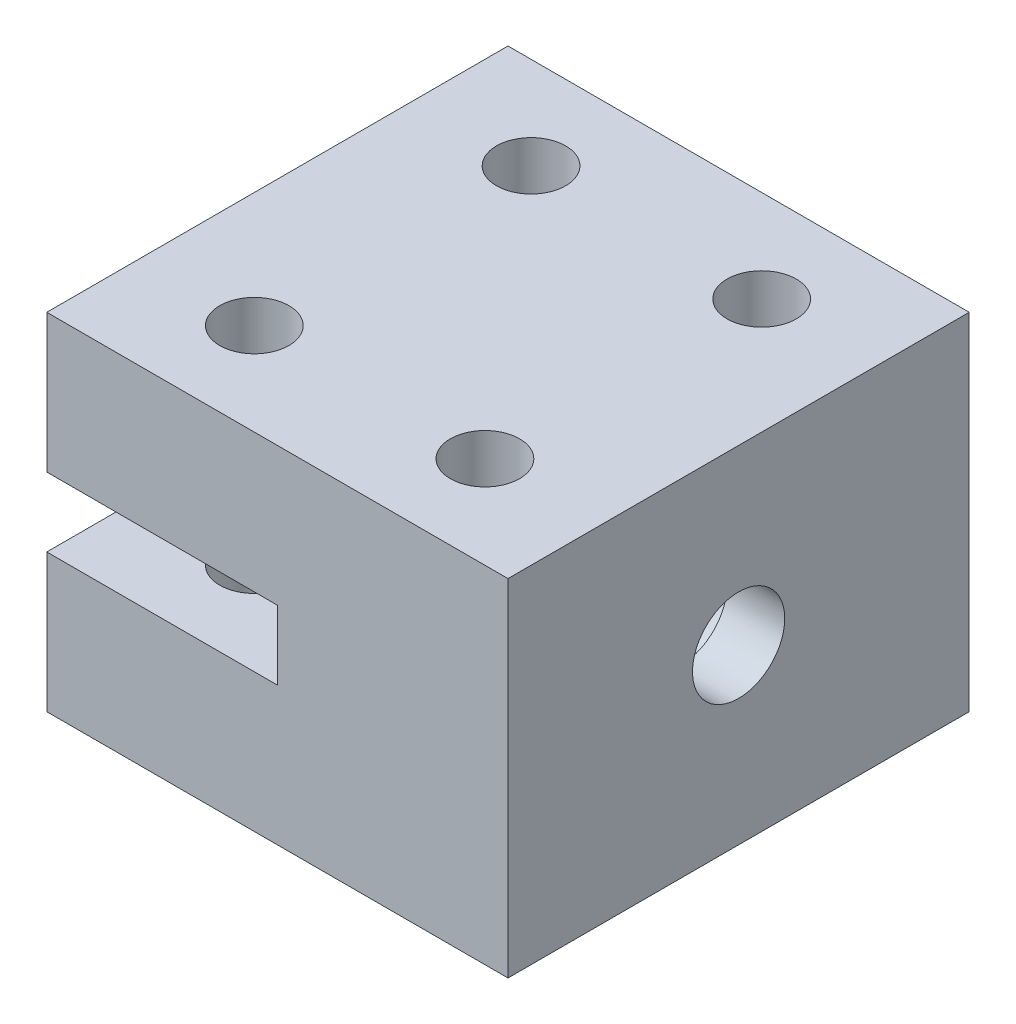
ISO-10303-21;
HEADER;
FILE_DESCRIPTION(('STEP AP214'),'2;1');
FILE_NAME('part.step','',(''),(''),'','','');
FILE_SCHEMA(('AUTOMOTIVE_DESIGN { 1 0 10303 214 1 1 1 1 }'));
ENDSEC;
DATA;
#1=APPLICATION_CONTEXT('core data for automotive mechanical design processes');
#2=APPLICATION_PROTOCOL_DEFINITION('international standard','automotive_design',2000,#1);
#3=PRODUCT_CONTEXT('',#1,'mechanical');
#4=PRODUCT('Part','Part','',(#3));
#5=PRODUCT_RELATED_PRODUCT_CATEGORY('part','',(#4));
#6=PRODUCT_DEFINITION_FORMATION('','',#4);
#7=PRODUCT_DEFINITION_CONTEXT('part definition',#1,'design');
#8=PRODUCT_DEFINITION('design','',#6,#7);
#9=PRODUCT_DEFINITION_SHAPE('','',#8);
#10=(LENGTH_UNIT() NAMED_UNIT(*) SI_UNIT(.MILLI.,.METRE.));
#11=(NAMED_UNIT(*) PLANE_ANGLE_UNIT() SI_UNIT($,.RADIAN.));
#12=(NAMED_UNIT(*) SI_UNIT($,.STERADIAN.) SOLID_ANGLE_UNIT());
#13=UNCERTAINTY_MEASURE_WITH_UNIT(LENGTH_MEASURE(1.E-05),#10,'distance_accuracy_value','');
#14=(GEOMETRIC_REPRESENTATION_CONTEXT(3) GLOBAL_UNCERTAINTY_ASSIGNED_CONTEXT((#13)) GLOBAL_UNIT_ASSIGNED_CONTEXT((#10,
#11,#12)) REPRESENTATION_CONTEXT('',''));
#15=CARTESIAN_POINT('',(0.,0.,0.));
#16=DIRECTION('',(0.,0.,1.));
#17=DIRECTION('',(1.,0.,0.));
#18=AXIS2_PLACEMENT_3D('',#15,#16,#17);
#19=CARTESIAN_POINT('',(9.99999999999999,7.5,-10.));
#20=DIRECTION('',(-1.,0.,0.));
#21=DIRECTION('',(0.,0.,1.));
#22=AXIS2_PLACEMENT_3D('',#19,#20,#21);
#23=PLANE('',#22);
#24=CARTESIAN_POINT('',(9.99999999999999,0.,0.));
#25=DIRECTION('',(1.,0.,0.));
#26=DIRECTION('',(0.,0.,-1.));
#27=AXIS2_PLACEMENT_3D('',#24,#25,#26);
#28=CIRCLE('',#27,2.);
#29=CARTESIAN_POINT('',(9.99999999999999,0.,-2.));
#30=VERTEX_POINT('',#29);
#31=EDGE_CURVE('E149',#30,#30,#28,.T.);
#32=ORIENTED_EDGE('',*,*,#31,.F.);
#33=EDGE_LOOP('',(#32));
#34=FACE_BOUND('',#33,.T.);
#35=DIRECTION('',(0.,-1.,0.));
#36=VECTOR('',#35,1.);
#37=CARTESIAN_POINT('',(9.99999999999999,7.5,-10.));
#38=LINE('',#37,#36);
#39=CARTESIAN_POINT('',(9.99999999999999,7.5,-10.));
#40=VERTEX_POINT('',#39);
#41=CARTESIAN_POINT('',(9.99999999999999,-7.5,-10.));
#42=VERTEX_POINT('',#41);
#43=EDGE_CURVE('E74',#40,#42,#38,.T.);
#44=ORIENTED_EDGE('',*,*,#43,.F.);
#45=DIRECTION('',(0.,0.,-1.));
#46=VECTOR('',#45,1.);
#47=CARTESIAN_POINT('',(9.99999999999999,7.5,-10.));
#48=LINE('',#47,#46);
#49=CARTESIAN_POINT('',(9.99999999999999,7.5,10.));
#50=VERTEX_POINT('',#49);
#51=EDGE_CURVE('E138',#50,#40,#48,.T.);
#52=ORIENTED_EDGE('',*,*,#51,.F.);
#53=DIRECTION('',(0.,-1.,0.));
#54=VECTOR('',#53,1.);
#55=CARTESIAN_POINT('',(9.99999999999999,7.5,10.));
#56=LINE('',#55,#54);
#57=CARTESIAN_POINT('',(9.99999999999999,-7.5,10.));
#58=VERTEX_POINT('',#57);
#59=EDGE_CURVE('E99',#50,#58,#56,.T.);
#60=ORIENTED_EDGE('',*,*,#59,.T.);
#61=DIRECTION('',(0.,0.,-1.));
#62=VECTOR('',#61,1.);
#63=CARTESIAN_POINT('',(9.99999999999999,-7.5,-10.));
#64=LINE('',#63,#62);
#65=EDGE_CURVE('E88',#58,#42,#64,.T.);
#66=ORIENTED_EDGE('',*,*,#65,.T.);
#67=EDGE_LOOP('',(#44,#52,#60,#66));
#68=FACE_BOUND('',#67,.T.);
#69=ADVANCED_FACE('F32',(#34,#68),#23,.F.);
#70=CARTESIAN_POINT('',(-10.,7.5,-10.));
#71=DIRECTION('',(0.,0.,1.));
#72=DIRECTION('',(1.,0.,0.));
#73=AXIS2_PLACEMENT_3D('',#70,#71,#72);
#74=PLANE('',#73);
#75=DIRECTION('',(-1.,0.,0.));
#76=VECTOR('',#75,1.);
#77=CARTESIAN_POINT('',(-10.,-1.5,-10.));
#78=LINE('',#77,#76);
#79=CARTESIAN_POINT('',(0.,-1.5,-10.));
#80=VERTEX_POINT('',#79);
#81=CARTESIAN_POINT('',(-10.,-1.5,-10.));
#82=VERTEX_POINT('',#81);
#83=EDGE_CURVE('E106',#80,#82,#78,.T.);
#84=ORIENTED_EDGE('',*,*,#83,.F.);
#85=DIRECTION('',(0.,-1.,0.));
#86=VECTOR('',#85,1.);
#87=CARTESIAN_POINT('',(0.,1.5,-10.));
#88=LINE('',#87,#86);
#89=CARTESIAN_POINT('',(0.,1.5,-10.));
#90=VERTEX_POINT('',#89);
#91=EDGE_CURVE('E118',#90,#80,#88,.T.);
#92=ORIENTED_EDGE('',*,*,#91,.F.);
#93=DIRECTION('',(-1.,0.,0.));
#94=VECTOR('',#93,1.);
#95=CARTESIAN_POINT('',(-10.,1.5,-10.));
#96=LINE('',#95,#94);
#97=CARTESIAN_POINT('',(-10.,1.5,-10.));
#98=VERTEX_POINT('',#97);
#99=EDGE_CURVE('E146',#90,#98,#96,.T.);
#100=ORIENTED_EDGE('',*,*,#99,.T.);
#101=DIRECTION('',(0.,-1.,0.));
#102=VECTOR('',#101,1.);
#103=CARTESIAN_POINT('',(-10.,7.5,-10.));
#104=LINE('',#103,#102);
#105=CARTESIAN_POINT('',(-10.,7.5,-10.));
#106=VERTEX_POINT('',#105);
#107=EDGE_CURVE('E123',#106,#98,#104,.T.);
#108=ORIENTED_EDGE('',*,*,#107,.F.);
#109=DIRECTION('',(-1.,0.,0.));
#110=VECTOR('',#109,1.);
#111=CARTESIAN_POINT('',(-10.,7.5,-10.));
#112=LINE('',#111,#110);
#113=EDGE_CURVE('E83',#40,#106,#112,.T.);
#114=ORIENTED_EDGE('',*,*,#113,.F.);
#115=ORIENTED_EDGE('',*,*,#43,.T.);
#116=DIRECTION('',(-1.,0.,0.));
#117=VECTOR('',#116,1.);
#118=CARTESIAN_POINT('',(-10.,-7.5,-10.));
#119=LINE('',#118,#117);
#120=CARTESIAN_POINT('',(-10.,-7.5,-10.));
#121=VERTEX_POINT('',#120);
#122=EDGE_CURVE('E78',#42,#121,#119,.T.);
#123=ORIENTED_EDGE('',*,*,#122,.T.);
#124=DIRECTION('',(0.,-1.,0.));
#125=VECTOR('',#124,1.);
#126=CARTESIAN_POINT('',(-10.,7.5,-10.));
#127=LINE('',#126,#125);
#128=EDGE_CURVE('E96',#82,#121,#127,.T.);
#129=ORIENTED_EDGE('',*,*,#128,.F.);
#130=EDGE_LOOP('',(#84,#92,#100,#108,#114,#115,#123,#129));
#131=FACE_BOUND('',#130,.T.);
#132=ADVANCED_FACE('F76',(#131),#74,.F.);
#133=CARTESIAN_POINT('',(-10.,7.5,-10.));
#134=DIRECTION('',(1.,0.,0.));
#135=DIRECTION('',(0.,0.,-1.));
#136=AXIS2_PLACEMENT_3D('',#133,#134,#135);
#137=PLANE('',#136);
#138=DIRECTION('',(0.,0.,1.));
#139=VECTOR('',#138,1.);
#140=CARTESIAN_POINT('',(-10.,-1.5,-10.));
#141=LINE('',#140,#139);
#142=CARTESIAN_POINT('',(-10.,-1.5,10.));
#143=VERTEX_POINT('',#142);
#144=EDGE_CURVE('E40',#82,#143,#141,.T.);
#145=ORIENTED_EDGE('',*,*,#144,.F.);
#146=ORIENTED_EDGE('',*,*,#128,.T.);
#147=DIRECTION('',(0.,0.,1.));
#148=VECTOR('',#147,1.);
#149=CARTESIAN_POINT('',(-10.,-7.5,-10.));
#150=LINE('',#149,#148);
#151=CARTESIAN_POINT('',(-10.,-7.5,10.));
#152=VERTEX_POINT('',#151);
#153=EDGE_CURVE('E95',#121,#152,#150,.T.);
#154=ORIENTED_EDGE('',*,*,#153,.T.);
#155=DIRECTION('',(0.,-1.,0.));
#156=VECTOR('',#155,1.);
#157=CARTESIAN_POINT('',(-10.,7.5,10.));
#158=LINE('',#157,#156);
#159=EDGE_CURVE('E110',#143,#152,#158,.T.);
#160=ORIENTED_EDGE('',*,*,#159,.F.);
#161=EDGE_LOOP('',(#145,#146,#154,#160));
#162=FACE_BOUND('',#161,.T.);
#163=ADVANCED_FACE('F224',(#162),#137,.F.);
#164=CARTESIAN_POINT('',(-10.,7.5,10.));
#165=DIRECTION('',(0.,0.,-1.));
#166=DIRECTION('',(-1.,0.,0.));
#167=AXIS2_PLACEMENT_3D('',#164,#165,#166);
#168=PLANE('',#167);
#169=DIRECTION('',(1.,0.,0.));
#170=VECTOR('',#169,1.);
#171=CARTESIAN_POINT('',(-10.,-1.5,10.));
#172=LINE('',#171,#170);
#173=CARTESIAN_POINT('',(0.,-1.5,10.));
#174=VERTEX_POINT('',#173);
#175=EDGE_CURVE('E11',#143,#174,#172,.T.);
#176=ORIENTED_EDGE('',*,*,#175,.F.);
#177=ORIENTED_EDGE('',*,*,#159,.T.);
#178=DIRECTION('',(1.,0.,0.));
#179=VECTOR('',#178,1.);
#180=CARTESIAN_POINT('',(-10.,-7.5,10.));
#181=LINE('',#180,#179);
#182=EDGE_CURVE('E107',#152,#58,#181,.T.);
#183=ORIENTED_EDGE('',*,*,#182,.T.);
#184=ORIENTED_EDGE('',*,*,#59,.F.);
#185=DIRECTION('',(1.,0.,0.));
#186=VECTOR('',#185,1.);
#187=CARTESIAN_POINT('',(-10.,7.5,10.));
#188=LINE('',#187,#186);
#189=CARTESIAN_POINT('',(-10.,7.5,10.));
#190=VERTEX_POINT('',#189);
#191=EDGE_CURVE('E131',#190,#50,#188,.T.);
#192=ORIENTED_EDGE('',*,*,#191,.F.);
#193=DIRECTION('',(0.,-1.,0.));
#194=VECTOR('',#193,1.);
#195=CARTESIAN_POINT('',(-10.,7.5,10.));
#196=LINE('',#195,#194);
#197=CARTESIAN_POINT('',(-10.,1.5,10.));
#198=VERTEX_POINT('',#197);
#199=EDGE_CURVE('E128',#190,#198,#196,.T.);
#200=ORIENTED_EDGE('',*,*,#199,.T.);
#201=DIRECTION('',(1.,0.,0.));
#202=VECTOR('',#201,1.);
#203=CARTESIAN_POINT('',(-10.,1.5,10.));
#204=LINE('',#203,#202);
#205=CARTESIAN_POINT('',(0.,1.5,10.));
#206=VERTEX_POINT('',#205);
#207=EDGE_CURVE('E140',#198,#206,#204,.T.);
#208=ORIENTED_EDGE('',*,*,#207,.T.);
#209=DIRECTION('',(0.,-1.,0.));
#210=VECTOR('',#209,1.);
#211=CARTESIAN_POINT('',(0.,1.5,10.));
#212=LINE('',#211,#210);
#213=EDGE_CURVE('E102',#206,#174,#212,.T.);
#214=ORIENTED_EDGE('',*,*,#213,.T.);
#215=EDGE_LOOP('',(#176,#177,#183,#184,#192,#200,#208,#214));
#216=FACE_BOUND('',#215,.T.);
#217=ADVANCED_FACE('F254',(#216),#168,.F.);
#218=CARTESIAN_POINT('',(0.,-7.5,0.));
#219=DIRECTION('',(0.,1.,0.));
#220=DIRECTION('',(0.,0.,1.));
#221=AXIS2_PLACEMENT_3D('',#218,#219,#220);
#222=PLANE('',#221);
#223=CARTESIAN_POINT('',(-5.,-7.5,6.));
#224=DIRECTION('',(0.,1.,0.));
#225=DIRECTION('',(0.,0.,1.));
#226=AXIS2_PLACEMENT_3D('',#223,#224,#225);
#227=CIRCLE('',#226,1.5);
#228=CARTESIAN_POINT('',(-5.,-7.5,7.5));
#229=VERTEX_POINT('',#228);
#230=EDGE_CURVE('E171',#229,#229,#227,.T.);
#231=ORIENTED_EDGE('',*,*,#230,.T.);
#232=EDGE_LOOP('',(#231));
#233=FACE_BOUND('',#232,.T.);
#234=CARTESIAN_POINT('',(5.,-7.5,6.));
#235=DIRECTION('',(0.,1.,0.));
#236=DIRECTION('',(0.,0.,1.));
#237=AXIS2_PLACEMENT_3D('',#234,#235,#236);
#238=CIRCLE('',#237,1.5);
#239=CARTESIAN_POINT('',(5.,-7.5,7.5));
#240=VERTEX_POINT('',#239);
#241=EDGE_CURVE('E178',#240,#240,#238,.T.);
#242=ORIENTED_EDGE('',*,*,#241,.T.);
#243=EDGE_LOOP('',(#242));
#244=FACE_BOUND('',#243,.T.);
#245=CARTESIAN_POINT('',(5.,-7.5,-6.));
#246=DIRECTION('',(0.,1.,0.));
#247=DIRECTION('',(0.,0.,1.));
#248=AXIS2_PLACEMENT_3D('',#245,#246,#247);
#249=CIRCLE('',#248,1.5);
#250=CARTESIAN_POINT('',(5.,-7.5,-4.5));
#251=VERTEX_POINT('',#250);
#252=EDGE_CURVE('E170',#251,#251,#249,.T.);
#253=ORIENTED_EDGE('',*,*,#252,.T.);
#254=EDGE_LOOP('',(#253));
#255=FACE_BOUND('',#254,.T.);
#256=CARTESIAN_POINT('',(-5.,-7.5,-6.));
#257=DIRECTION('',(0.,1.,0.));
#258=DIRECTION('',(0.,0.,1.));
#259=AXIS2_PLACEMENT_3D('',#256,#257,#258);
#260=CIRCLE('',#259,1.5);
#261=CARTESIAN_POINT('',(-5.,-7.5,-4.5));
#262=VERTEX_POINT('',#261);
#263=EDGE_CURVE('E164',#262,#262,#260,.T.);
#264=ORIENTED_EDGE('',*,*,#263,.T.);
#265=EDGE_LOOP('',(#264));
#266=FACE_BOUND('',#265,.T.);
#267=ORIENTED_EDGE('',*,*,#65,.F.);
#268=ORIENTED_EDGE('',*,*,#182,.F.);
#269=ORIENTED_EDGE('',*,*,#153,.F.);
#270=ORIENTED_EDGE('',*,*,#122,.F.);
#271=EDGE_LOOP('',(#267,#268,#269,#270));
#272=FACE_BOUND('',#271,.T.);
#273=ADVANCED_FACE('F92',(#233,#244,#255,#266,#272),#222,.F.);
#274=CARTESIAN_POINT('',(0.,-1.5,0.));
#275=DIRECTION('',(0.,1.,0.));
#276=DIRECTION('',(0.,0.,1.));
#277=AXIS2_PLACEMENT_3D('',#274,#275,#276);
#278=PLANE('',#277);
#279=CARTESIAN_POINT('',(-5.,-1.5,6.));
#280=DIRECTION('',(0.,1.,0.));
#281=DIRECTION('',(0.,0.,1.));
#282=AXIS2_PLACEMENT_3D('',#279,#280,#281);
#283=CIRCLE('',#282,1.5);
#284=CARTESIAN_POINT('',(-5.,-1.5,7.5));
#285=VERTEX_POINT('',#284);
#286=EDGE_CURVE('E152',#285,#285,#283,.T.);
#287=ORIENTED_EDGE('',*,*,#286,.F.);
#288=EDGE_LOOP('',(#287));
#289=FACE_BOUND('',#288,.T.);
#290=CARTESIAN_POINT('',(-5.,-1.5,-6.));
#291=DIRECTION('',(0.,1.,0.));
#292=DIRECTION('',(0.,0.,1.));
#293=AXIS2_PLACEMENT_3D('',#290,#291,#292);
#294=CIRCLE('',#293,1.5);
#295=CARTESIAN_POINT('',(-5.,-1.5,-4.5));
#296=VERTEX_POINT('',#295);
#297=EDGE_CURVE('E158',#296,#296,#294,.T.);
#298=ORIENTED_EDGE('',*,*,#297,.F.);
#299=EDGE_LOOP('',(#298));
#300=FACE_BOUND('',#299,.T.);
#301=DIRECTION('',(0.,0.,1.));
#302=VECTOR('',#301,1.);
#303=CARTESIAN_POINT('',(0.,-1.5,-10.));
#304=LINE('',#303,#302);
#305=EDGE_CURVE('E47',#80,#174,#304,.T.);
#306=ORIENTED_EDGE('',*,*,#305,.F.);
#307=ORIENTED_EDGE('',*,*,#83,.T.);
#308=ORIENTED_EDGE('',*,*,#144,.T.);
#309=ORIENTED_EDGE('',*,*,#175,.T.);
#310=EDGE_LOOP('',(#306,#307,#308,#309));
#311=FACE_BOUND('',#310,.T.);
#312=ADVANCED_FACE('F251',(#289,#300,#311),#278,.T.);
#313=CARTESIAN_POINT('',(0.,1.5,-10.));
#314=DIRECTION('',(1.,0.,0.));
#315=DIRECTION('',(0.,0.,-1.));
#316=AXIS2_PLACEMENT_3D('',#313,#314,#315);
#317=PLANE('',#316);
#318=ORIENTED_EDGE('',*,*,#305,.T.);
#319=ORIENTED_EDGE('',*,*,#213,.F.);
#320=DIRECTION('',(0.,0.,1.));
#321=VECTOR('',#320,1.);
#322=CARTESIAN_POINT('',(0.,1.5,-10.));
#323=LINE('',#322,#321);
#324=EDGE_CURVE('E121',#90,#206,#323,.T.);
#325=ORIENTED_EDGE('',*,*,#324,.F.);
#326=ORIENTED_EDGE('',*,*,#91,.T.);
#327=EDGE_LOOP('',(#318,#319,#325,#326));
#328=FACE_BOUND('',#327,.T.);
#329=ADVANCED_FACE('F245',(#328),#317,.F.);
#330=CARTESIAN_POINT('',(0.,1.5,0.));
#331=DIRECTION('',(0.,1.,0.));
#332=DIRECTION('',(0.,0.,1.));
#333=AXIS2_PLACEMENT_3D('',#330,#331,#332);
#334=PLANE('',#333);
#335=CARTESIAN_POINT('',(-5.,1.5,6.));
#336=DIRECTION('',(0.,1.,0.));
#337=DIRECTION('',(0.,0.,1.));
#338=AXIS2_PLACEMENT_3D('',#335,#336,#337);
#339=CIRCLE('',#338,1.5);
#340=CARTESIAN_POINT('',(-5.,1.5,7.5));
#341=VERTEX_POINT('',#340);
#342=EDGE_CURVE('E155',#341,#341,#339,.T.);
#343=ORIENTED_EDGE('',*,*,#342,.T.);
#344=EDGE_LOOP('',(#343));
#345=FACE_BOUND('',#344,.T.);
#346=CARTESIAN_POINT('',(-5.,1.5,-6.));
#347=DIRECTION('',(0.,1.,0.));
#348=DIRECTION('',(0.,0.,1.));
#349=AXIS2_PLACEMENT_3D('',#346,#347,#348);
#350=CIRCLE('',#349,1.5);
#351=CARTESIAN_POINT('',(-5.,1.5,-4.5));
#352=VERTEX_POINT('',#351);
#353=EDGE_CURVE('E161',#352,#352,#350,.T.);
#354=ORIENTED_EDGE('',*,*,#353,.T.);
#355=EDGE_LOOP('',(#354));
#356=FACE_BOUND('',#355,.T.);
#357=ORIENTED_EDGE('',*,*,#99,.F.);
#358=ORIENTED_EDGE('',*,*,#324,.T.);
#359=ORIENTED_EDGE('',*,*,#207,.F.);
#360=DIRECTION('',(0.,0.,1.));
#361=VECTOR('',#360,1.);
#362=CARTESIAN_POINT('',(-10.,1.5,-10.));
#363=LINE('',#362,#361);
#364=EDGE_CURVE('E143',#98,#198,#363,.T.);
#365=ORIENTED_EDGE('',*,*,#364,.F.);
#366=EDGE_LOOP('',(#357,#358,#359,#365));
#367=FACE_BOUND('',#366,.T.);
#368=ADVANCED_FACE('F242',(#345,#356,#367),#334,.F.);
#369=CARTESIAN_POINT('',(0.,7.5,0.));
#370=DIRECTION('',(0.,1.,0.));
#371=DIRECTION('',(0.,0.,1.));
#372=AXIS2_PLACEMENT_3D('',#369,#370,#371);
#373=PLANE('',#372);
#374=CARTESIAN_POINT('',(-5.,7.5,6.));
#375=DIRECTION('',(0.,1.,0.));
#376=DIRECTION('',(0.,0.,1.));
#377=AXIS2_PLACEMENT_3D('',#374,#375,#376);
#378=CIRCLE('',#377,1.5);
#379=CARTESIAN_POINT('',(-5.,7.5,7.5));
#380=VERTEX_POINT('',#379);
#381=EDGE_CURVE('E175',#380,#380,#378,.T.);
#382=ORIENTED_EDGE('',*,*,#381,.F.);
#383=EDGE_LOOP('',(#382));
#384=FACE_BOUND('',#383,.T.);
#385=CARTESIAN_POINT('',(5.,7.5,6.));
#386=DIRECTION('',(0.,1.,0.));
#387=DIRECTION('',(0.,0.,1.));
#388=AXIS2_PLACEMENT_3D('',#385,#386,#387);
#389=CIRCLE('',#388,1.5);
#390=CARTESIAN_POINT('',(5.,7.5,7.5));
#391=VERTEX_POINT('',#390);
#392=EDGE_CURVE('E174',#391,#391,#389,.T.);
#393=ORIENTED_EDGE('',*,*,#392,.F.);
#394=EDGE_LOOP('',(#393));
#395=FACE_BOUND('',#394,.T.);
#396=CARTESIAN_POINT('',(5.,7.5,-6.));
#397=DIRECTION('',(0.,1.,0.));
#398=DIRECTION('',(0.,0.,1.));
#399=AXIS2_PLACEMENT_3D('',#396,#397,#398);
#400=CIRCLE('',#399,1.5);
#401=CARTESIAN_POINT('',(5.,7.5,-4.5));
#402=VERTEX_POINT('',#401);
#403=EDGE_CURVE('E181',#402,#402,#400,.T.);
#404=ORIENTED_EDGE('',*,*,#403,.F.);
#405=EDGE_LOOP('',(#404));
#406=FACE_BOUND('',#405,.T.);
#407=CARTESIAN_POINT('',(-5.,7.5,-6.));
#408=DIRECTION('',(0.,1.,0.));
#409=DIRECTION('',(0.,0.,1.));
#410=AXIS2_PLACEMENT_3D('',#407,#408,#409);
#411=CIRCLE('',#410,1.5);
#412=CARTESIAN_POINT('',(-5.,7.5,-4.5));
#413=VERTEX_POINT('',#412);
#414=EDGE_CURVE('E167',#413,#413,#411,.T.);
#415=ORIENTED_EDGE('',*,*,#414,.F.);
#416=EDGE_LOOP('',(#415));
#417=FACE_BOUND('',#416,.T.);
#418=ORIENTED_EDGE('',*,*,#51,.T.);
#419=ORIENTED_EDGE('',*,*,#113,.T.);
#420=DIRECTION('',(0.,0.,1.));
#421=VECTOR('',#420,1.);
#422=CARTESIAN_POINT('',(-10.,7.5,-10.));
#423=LINE('',#422,#421);
#424=EDGE_CURVE('E134',#106,#190,#423,.T.);
#425=ORIENTED_EDGE('',*,*,#424,.T.);
#426=ORIENTED_EDGE('',*,*,#191,.T.);
#427=EDGE_LOOP('',(#418,#419,#425,#426));
#428=FACE_BOUND('',#427,.T.);
#429=ADVANCED_FACE('F237',(#384,#395,#406,#417,#428),#373,.T.);
#430=CARTESIAN_POINT('',(-10.,7.5,-10.));
#431=DIRECTION('',(1.,0.,0.));
#432=DIRECTION('',(0.,0.,-1.));
#433=AXIS2_PLACEMENT_3D('',#430,#431,#432);
#434=PLANE('',#433);
#435=ORIENTED_EDGE('',*,*,#107,.T.);
#436=ORIENTED_EDGE('',*,*,#364,.T.);
#437=ORIENTED_EDGE('',*,*,#199,.F.);
#438=ORIENTED_EDGE('',*,*,#424,.F.);
#439=EDGE_LOOP('',(#435,#436,#437,#438));
#440=FACE_BOUND('',#439,.T.);
#441=ADVANCED_FACE('F228',(#440),#434,.F.);
#442=CARTESIAN_POINT('',(4.99999999999999,0.,0.));
#443=DIRECTION('',(1.,0.,0.));
#444=DIRECTION('',(0.,0.,-1.));
#445=AXIS2_PLACEMENT_3D('',#442,#443,#444);
#446=CYLINDRICAL_SURFACE('',#445,2.);
#447=CARTESIAN_POINT('',(7.49999999999999,0.,0.));
#448=DIRECTION('',(1.,0.,0.));
#449=DIRECTION('',(0.,0.,-1.));
#450=AXIS2_PLACEMENT_3D('',#447,#448,#449);
#451=CIRCLE('',#450,2.);
#452=CARTESIAN_POINT('',(7.49999999999999,0.,-2.));
#453=VERTEX_POINT('',#452);
#454=EDGE_CURVE('E35',#453,#453,#451,.F.);
#455=ORIENTED_EDGE('',*,*,#454,.T.);
#456=EDGE_LOOP('',(#455));
#457=FACE_BOUND('',#456,.T.);
#458=ORIENTED_EDGE('',*,*,#31,.T.);
#459=EDGE_LOOP('',(#458));
#460=FACE_BOUND('',#459,.T.);
#461=ADVANCED_FACE('F198',(#457,#460),#446,.F.);
#462=CARTESIAN_POINT('',(-5.,-7.5,-6.));
#463=DIRECTION('',(0.,1.,0.));
#464=DIRECTION('',(0.,0.,1.));
#465=AXIS2_PLACEMENT_3D('',#462,#463,#464);
#466=CYLINDRICAL_SURFACE('',#465,1.5);
#467=ORIENTED_EDGE('',*,*,#414,.T.);
#468=EDGE_LOOP('',(#467));
#469=FACE_BOUND('',#468,.T.);
#470=ORIENTED_EDGE('',*,*,#353,.F.);
#471=EDGE_LOOP('',(#470));
#472=FACE_BOUND('',#471,.T.);
#473=ADVANCED_FACE('F227',(#469,#472),#466,.F.);
#474=CARTESIAN_POINT('',(5.,-7.5,-6.));
#475=DIRECTION('',(0.,1.,0.));
#476=DIRECTION('',(0.,0.,1.));
#477=AXIS2_PLACEMENT_3D('',#474,#475,#476);
#478=CYLINDRICAL_SURFACE('',#477,1.5);
#479=ORIENTED_EDGE('',*,*,#252,.F.);
#480=EDGE_LOOP('',(#479));
#481=FACE_BOUND('',#480,.T.);
#482=ORIENTED_EDGE('',*,*,#403,.T.);
#483=EDGE_LOOP('',(#482));
#484=FACE_BOUND('',#483,.T.);
#485=ADVANCED_FACE('F234',(#481,#484),#478,.F.);
#486=CARTESIAN_POINT('',(5.,-7.5,6.));
#487=DIRECTION('',(0.,1.,0.));
#488=DIRECTION('',(0.,0.,1.));
#489=AXIS2_PLACEMENT_3D('',#486,#487,#488);
#490=CYLINDRICAL_SURFACE('',#489,1.5);
#491=ORIENTED_EDGE('',*,*,#241,.F.);
#492=EDGE_LOOP('',(#491));
#493=FACE_BOUND('',#492,.T.);
#494=ORIENTED_EDGE('',*,*,#392,.T.);
#495=EDGE_LOOP('',(#494));
#496=FACE_BOUND('',#495,.T.);
#497=ADVANCED_FACE('F367',(#493,#496),#490,.F.);
#498=CARTESIAN_POINT('',(-5.,-7.5,6.));
#499=DIRECTION('',(0.,1.,0.));
#500=DIRECTION('',(0.,0.,1.));
#501=AXIS2_PLACEMENT_3D('',#498,#499,#500);
#502=CYLINDRICAL_SURFACE('',#501,1.5);
#503=ORIENTED_EDGE('',*,*,#381,.T.);
#504=EDGE_LOOP('',(#503));
#505=FACE_BOUND('',#504,.T.);
#506=ORIENTED_EDGE('',*,*,#342,.F.);
#507=EDGE_LOOP('',(#506));
#508=FACE_BOUND('',#507,.T.);
#509=ADVANCED_FACE('F216',(#505,#508),#502,.F.);
#510=ORIENTED_EDGE('',*,*,#297,.T.);
#511=EDGE_LOOP('',(#510));
#512=FACE_BOUND('',#511,.T.);
#513=ORIENTED_EDGE('',*,*,#263,.F.);
#514=EDGE_LOOP('',(#513));
#515=FACE_BOUND('',#514,.T.);
#516=ADVANCED_FACE('F213',(#512,#515),#466,.F.);
#517=ORIENTED_EDGE('',*,*,#286,.T.);
#518=EDGE_LOOP('',(#517));
#519=FACE_BOUND('',#518,.T.);
#520=ORIENTED_EDGE('',*,*,#230,.F.);
#521=EDGE_LOOP('',(#520));
#522=FACE_BOUND('',#521,.T.);
#523=ADVANCED_FACE('F204',(#519,#522),#502,.F.);
#524=CARTESIAN_POINT('',(7.49999999999999,0.,0.));
#525=DIRECTION('',(1.,0.,0.));
#526=DIRECTION('',(0.,0.,-1.));
#527=AXIS2_PLACEMENT_3D('',#524,#525,#526);
#528=PLANE('',#527);
#529=CARTESIAN_POINT('',(7.49999999999999,0.,0.));
#530=DIRECTION('',(1.,0.,0.));
#531=DIRECTION('',(0.,0.,-1.));
#532=AXIS2_PLACEMENT_3D('',#529,#530,#531);
#533=CIRCLE('',#532,3.5);
#534=CARTESIAN_POINT('',(7.49999999999999,0.,-3.5));
#535=VERTEX_POINT('',#534);
#536=EDGE_CURVE('E191',#535,#535,#533,.T.);
#537=ORIENTED_EDGE('',*,*,#536,.F.);
#538=EDGE_LOOP('',(#537));
#539=FACE_BOUND('',#538,.T.);
#540=ORIENTED_EDGE('',*,*,#454,.F.);
#541=EDGE_LOOP('',(#540));
#542=FACE_BOUND('',#541,.T.);
#543=ADVANCED_FACE('F201',(#539,#542),#528,.F.);
#544=CARTESIAN_POINT('',(7.49999999999999,0.,0.));
#545=DIRECTION('',(-1.,0.,0.));
#546=DIRECTION('',(0.,0.,1.));
#547=AXIS2_PLACEMENT_3D('',#544,#545,#546);
#548=CYLINDRICAL_SURFACE('',#547,3.5);
#549=ORIENTED_EDGE('',*,*,#536,.T.);
#550=EDGE_LOOP('',(#549));
#551=FACE_BOUND('',#550,.T.);
#552=CARTESIAN_POINT('',(4.99999999999999,0.,0.));
#553=DIRECTION('',(1.,0.,0.));
#554=DIRECTION('',(0.,0.,-1.));
#555=AXIS2_PLACEMENT_3D('',#552,#553,#554);
#556=CIRCLE('',#555,3.5);
#557=CARTESIAN_POINT('',(4.99999999999999,0.,-3.5));
#558=VERTEX_POINT('',#557);
#559=EDGE_CURVE('E188',#558,#558,#556,.T.);
#560=ORIENTED_EDGE('',*,*,#559,.F.);
#561=EDGE_LOOP('',(#560));
#562=FACE_BOUND('',#561,.T.);
#563=ADVANCED_FACE('F203',(#551,#562),#548,.F.);
#564=CARTESIAN_POINT('',(4.99999999999999,0.,0.));
#565=DIRECTION('',(1.,0.,0.));
#566=DIRECTION('',(0.,0.,-1.));
#567=AXIS2_PLACEMENT_3D('',#564,#565,#566);
#568=PLANE('',#567);
#569=ORIENTED_EDGE('',*,*,#559,.T.);
#570=EDGE_LOOP('',(#569));
#571=FACE_BOUND('',#570,.T.);
#572=ADVANCED_FACE('F211',(#571),#568,.T.);
#573=CLOSED_SHELL('',(#69,#132,#163,#217,#273,#312,#329,#368,#429,#441,#461,#473,#485,#497,#509,
#516,#523,#543,#563,#572));
#574=MANIFOLD_SOLID_BREP('B2',#573);
#575=ADVANCED_BREP_SHAPE_REPRESENTATION('',(#18,#574),#14);
#576=SHAPE_DEFINITION_REPRESENTATION(#9,#575);
ENDSEC;
END-ISO-10303-21;
